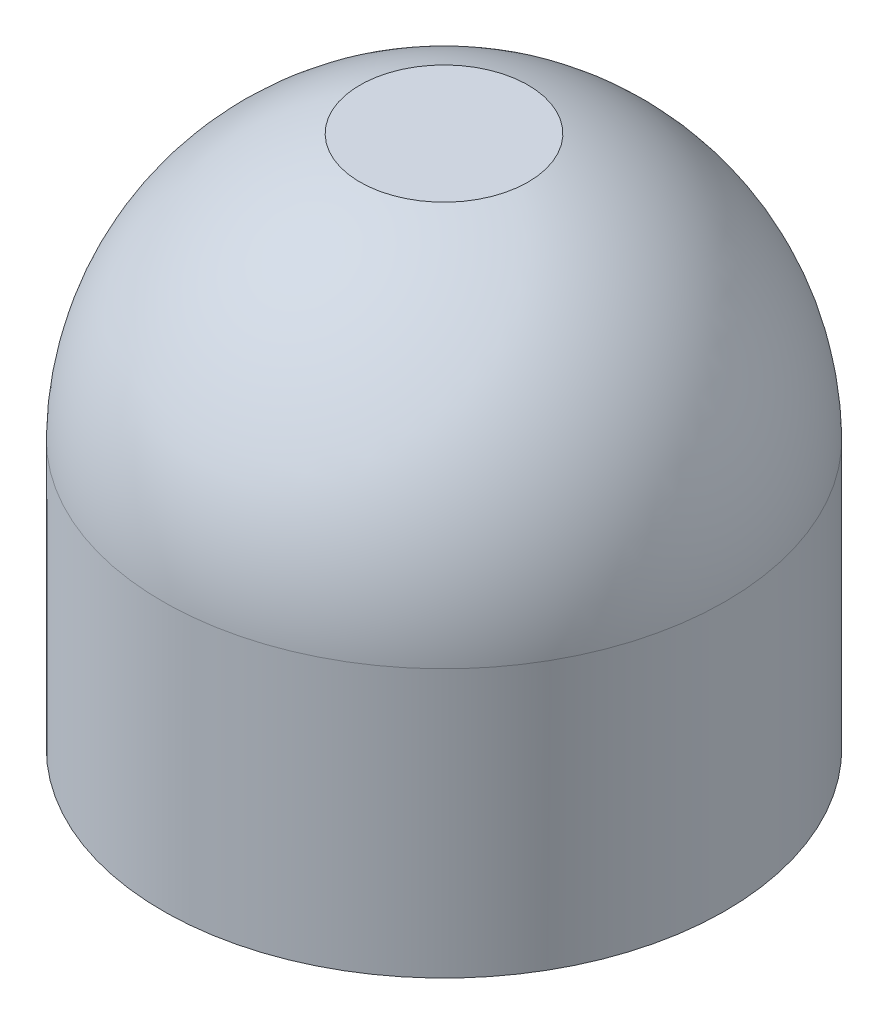
ISO-10303-21;
HEADER;
FILE_DESCRIPTION(('STEP AP214'),'2;1');
FILE_NAME('part.step','',(''),(''),'','','');
FILE_SCHEMA(('AUTOMOTIVE_DESIGN { 1 0 10303 214 1 1 1 1 }'));
ENDSEC;
DATA;
#1=APPLICATION_CONTEXT('core data for automotive mechanical design processes');
#2=APPLICATION_PROTOCOL_DEFINITION('international standard','automotive_design',2000,#1);
#3=PRODUCT_CONTEXT('',#1,'mechanical');
#4=PRODUCT('Part','Part','',(#3));
#5=PRODUCT_RELATED_PRODUCT_CATEGORY('part','',(#4));
#6=PRODUCT_DEFINITION_FORMATION('','',#4);
#7=PRODUCT_DEFINITION_CONTEXT('part definition',#1,'design');
#8=PRODUCT_DEFINITION('design','',#6,#7);
#9=PRODUCT_DEFINITION_SHAPE('','',#8);
#10=(LENGTH_UNIT() NAMED_UNIT(*) SI_UNIT(.MILLI.,.METRE.));
#11=(NAMED_UNIT(*) PLANE_ANGLE_UNIT() SI_UNIT($,.RADIAN.));
#12=(NAMED_UNIT(*) SI_UNIT($,.STERADIAN.) SOLID_ANGLE_UNIT());
#13=UNCERTAINTY_MEASURE_WITH_UNIT(LENGTH_MEASURE(1.E-05),#10,'distance_accuracy_value','');
#14=(GEOMETRIC_REPRESENTATION_CONTEXT(3) GLOBAL_UNCERTAINTY_ASSIGNED_CONTEXT((#13)) GLOBAL_UNIT_ASSIGNED_CONTEXT((#10,
#11,#12)) REPRESENTATION_CONTEXT('',''));
#15=CARTESIAN_POINT('',(0.,0.,0.));
#16=DIRECTION('',(0.,0.,1.));
#17=DIRECTION('',(1.,0.,0.));
#18=AXIS2_PLACEMENT_3D('',#15,#16,#17);
#19=CARTESIAN_POINT('',(0.,5.,0.));
#20=DIRECTION('',(0.,-1.,0.));
#21=DIRECTION('',(0.,0.,-1.));
#22=AXIS2_PLACEMENT_3D('',#19,#20,#21);
#23=CYLINDRICAL_SURFACE('',#22,4.5);
#24=CARTESIAN_POINT('',(0.,1.42618540526485,0.));
#25=DIRECTION('',(0.,1.,0.));
#26=DIRECTION('',(0.,0.,1.));
#27=AXIS2_PLACEMENT_3D('',#24,#25,#26);
#28=CIRCLE('',#27,4.5);
#29=CARTESIAN_POINT('',(-1.5,1.42618540526485,-4.24264068711928));
#30=VERTEX_POINT('',#29);
#31=CARTESIAN_POINT('',(1.32768914699,1.42618540526485,-4.29967923559014));
#32=VERTEX_POINT('',#31);
#33=EDGE_CURVE('E168',#30,#32,#28,.T.);
#34=ORIENTED_EDGE('',*,*,#33,.T.);
#35=DIRECTION('',(0.,-1.,0.));
#36=VECTOR('',#35,1.);
#37=CARTESIAN_POINT('',(1.32768914699,5.,-4.29967923559014));
#38=LINE('',#37,#36);
#39=CARTESIAN_POINT('',(1.32768914699,0.,-4.29967923559014));
#40=VERTEX_POINT('',#39);
#41=EDGE_CURVE('E139',#32,#40,#38,.T.);
#42=ORIENTED_EDGE('',*,*,#41,.T.);
#43=CARTESIAN_POINT('',(0.,0.,0.));
#44=DIRECTION('',(0.,1.,0.));
#45=DIRECTION('',(0.,0.,1.));
#46=AXIS2_PLACEMENT_3D('',#43,#44,#45);
#47=CIRCLE('',#46,4.5);
#48=CARTESIAN_POINT('',(-1.5,0.,-4.24264068711928));
#49=VERTEX_POINT('',#48);
#50=EDGE_CURVE('E203',#49,#40,#47,.T.);
#51=ORIENTED_EDGE('',*,*,#50,.F.);
#52=DIRECTION('',(0.,-1.,0.));
#53=VECTOR('',#52,1.);
#54=CARTESIAN_POINT('',(-1.5,5.,-4.24264068711928));
#55=LINE('',#54,#53);
#56=EDGE_CURVE('E216',#49,#30,#55,.F.);
#57=ORIENTED_EDGE('',*,*,#56,.T.);
#58=EDGE_LOOP('',(#34,#42,#51,#57));
#59=FACE_BOUND('',#58,.T.);
#60=ADVANCED_FACE('F32',(#59),#23,.F.);
#61=CARTESIAN_POINT('',(0.,0.,0.));
#62=DIRECTION('',(0.,1.,0.));
#63=DIRECTION('',(0.,0.,1.));
#64=AXIS2_PLACEMENT_3D('',#61,#62,#63);
#65=PLANE('',#64);
#66=DIRECTION('',(0.,0.,-1.));
#67=VECTOR('',#66,1.);
#68=CARTESIAN_POINT('',(1.32768914699,0.,-3.79563732174866));
#69=LINE('',#68,#67);
#70=CARTESIAN_POINT('',(1.32768914699,0.,-5.07934459639873));
#71=VERTEX_POINT('',#70);
#72=EDGE_CURVE('E192',#40,#71,#69,.T.);
#73=ORIENTED_EDGE('',*,*,#72,.T.);
#74=CARTESIAN_POINT('',(0.,0.,0.));
#75=DIRECTION('',(0.,1.,0.));
#76=DIRECTION('',(0.,0.,1.));
#77=AXIS2_PLACEMENT_3D('',#74,#75,#76);
#78=CIRCLE('',#77,5.25);
#79=CARTESIAN_POINT('',(-1.5,0.,-5.03115294937453));
#80=VERTEX_POINT('',#79);
#81=EDGE_CURVE('E207',#80,#71,#78,.T.);
#82=ORIENTED_EDGE('',*,*,#81,.F.);
#83=DIRECTION('',(0.,0.,1.));
#84=VECTOR('',#83,1.);
#85=CARTESIAN_POINT('',(-1.5,0.,-5.7011070865442));
#86=LINE('',#85,#84);
#87=EDGE_CURVE('E195',#80,#49,#86,.T.);
#88=ORIENTED_EDGE('',*,*,#87,.T.);
#89=ORIENTED_EDGE('',*,*,#50,.T.);
#90=EDGE_LOOP('',(#73,#82,#88,#89));
#91=FACE_BOUND('',#90,.T.);
#92=ADVANCED_FACE('F244',(#91),#65,.F.);
#93=CARTESIAN_POINT('',(0.,5.,0.));
#94=DIRECTION('',(0.,-1.,0.));
#95=DIRECTION('',(0.,0.,-1.));
#96=AXIS2_PLACEMENT_3D('',#93,#94,#95);
#97=CYLINDRICAL_SURFACE('',#96,5.25);
#98=DIRECTION('',(0.,-1.,0.));
#99=VECTOR('',#98,1.);
#100=CARTESIAN_POINT('',(1.32768914699,5.,-5.07934459639873));
#101=LINE('',#100,#99);
#102=CARTESIAN_POINT('',(1.32768914699,5.,-5.07934459639873));
#103=VERTEX_POINT('',#102);
#104=EDGE_CURVE('E201',#103,#71,#101,.T.);
#105=ORIENTED_EDGE('',*,*,#104,.F.);
#106=CARTESIAN_POINT('',(0.,5.,0.));
#107=DIRECTION('',(0.,1.,0.));
#108=DIRECTION('',(0.,0.,1.));
#109=AXIS2_PLACEMENT_3D('',#106,#107,#108);
#110=CIRCLE('',#109,5.25);
#111=CARTESIAN_POINT('',(-1.5,5.,-5.03115294937453));
#112=VERTEX_POINT('',#111);
#113=EDGE_CURVE('E210',#112,#103,#110,.T.);
#114=ORIENTED_EDGE('',*,*,#113,.F.);
#115=DIRECTION('',(0.,-1.,0.));
#116=VECTOR('',#115,1.);
#117=CARTESIAN_POINT('',(-1.5,5.,-5.03115294937453));
#118=LINE('',#117,#116);
#119=EDGE_CURVE('E198',#80,#112,#118,.F.);
#120=ORIENTED_EDGE('',*,*,#119,.F.);
#121=ORIENTED_EDGE('',*,*,#81,.T.);
#122=EDGE_LOOP('',(#105,#114,#120,#121));
#123=FACE_BOUND('',#122,.T.);
#124=ADVANCED_FACE('F34',(#123),#97,.T.);
#125=CARTESIAN_POINT('',(0.,2.02618540526485,0.));
#126=DIRECTION('',(0.,1.,0.));
#127=DIRECTION('',(0.,0.,1.));
#128=AXIS2_PLACEMENT_3D('',#125,#126,#127);
#129=CIRCLE('',#128,4.5);
#130=CARTESIAN_POINT('',(-1.5,2.02618540526485,-4.24264068711928));
#131=VERTEX_POINT('',#130);
#132=CARTESIAN_POINT('',(1.32768914699,2.02618540526485,-4.29967923559014));
#133=VERTEX_POINT('',#132);
#134=EDGE_CURVE('E48',#131,#133,#129,.T.);
#135=ORIENTED_EDGE('',*,*,#134,.F.);
#136=CARTESIAN_POINT('',(-1.5,5.,-4.24264068711928));
#137=VERTEX_POINT('',#136);
#138=EDGE_CURVE('E213',#131,#137,#55,.F.);
#139=ORIENTED_EDGE('',*,*,#138,.T.);
#140=CARTESIAN_POINT('',(0.,5.,0.));
#141=DIRECTION('',(0.,1.,0.));
#142=DIRECTION('',(0.,0.,1.));
#143=AXIS2_PLACEMENT_3D('',#140,#141,#142);
#144=CIRCLE('',#143,4.5);
#145=CARTESIAN_POINT('',(1.32768914699,5.,-4.29967923559014));
#146=VERTEX_POINT('',#145);
#147=EDGE_CURVE('E204',#137,#146,#144,.T.);
#148=ORIENTED_EDGE('',*,*,#147,.T.);
#149=EDGE_CURVE('E218',#146,#133,#38,.T.);
#150=ORIENTED_EDGE('',*,*,#149,.T.);
#151=EDGE_LOOP('',(#135,#139,#148,#150));
#152=FACE_BOUND('',#151,.T.);
#153=ADVANCED_FACE('F254',(#152),#23,.F.);
#154=CARTESIAN_POINT('',(-1.5,5.,-5.7011070865442));
#155=DIRECTION('',(1.,0.,0.));
#156=DIRECTION('',(0.,0.,-1.));
#157=AXIS2_PLACEMENT_3D('',#154,#155,#156);
#158=PLANE('',#157);
#159=ORIENTED_EDGE('',*,*,#119,.T.);
#160=CARTESIAN_POINT('',(-1.5,4.92952702702703,0.));
#161=DIRECTION('',(-1.,0.,0.));
#162=DIRECTION('',(0.,0.,1.));
#163=AXIS2_PLACEMENT_3D('',#160,#161,#162);
#164=CIRCLE('',#163,5.03164649393413);
#165=CARTESIAN_POINT('',(-1.5,7.,-4.58591409733197));
#166=VERTEX_POINT('',#165);
#167=EDGE_CURVE('E187',#112,#166,#164,.F.);
#168=ORIENTED_EDGE('',*,*,#167,.T.);
#169=DIRECTION('',(0.,0.,-1.));
#170=VECTOR('',#169,1.);
#171=CARTESIAN_POINT('',(-1.5,7.,-3.43693177121688));
#172=LINE('',#171,#170);
#173=CARTESIAN_POINT('',(-1.5,7.,-3.43693177121688));
#174=VERTEX_POINT('',#173);
#175=EDGE_CURVE('E176',#174,#166,#172,.T.);
#176=ORIENTED_EDGE('',*,*,#175,.F.);
#177=DIRECTION('',(0.,-1.,0.));
#178=VECTOR('',#177,1.);
#179=CARTESIAN_POINT('',(-1.5,7.,-3.43693177121688));
#180=LINE('',#179,#178);
#181=CARTESIAN_POINT('',(-1.5,5.,-3.43693177121688));
#182=VERTEX_POINT('',#181);
#183=EDGE_CURVE('E185',#174,#182,#180,.T.);
#184=ORIENTED_EDGE('',*,*,#183,.T.);
#185=DIRECTION('',(0.,0.,-1.));
#186=VECTOR('',#185,1.);
#187=CARTESIAN_POINT('',(-1.5,5.,-3.43693177121688));
#188=LINE('',#187,#186);
#189=EDGE_CURVE('E173',#182,#137,#188,.T.);
#190=ORIENTED_EDGE('',*,*,#189,.T.);
#191=ORIENTED_EDGE('',*,*,#138,.F.);
#192=DIRECTION('',(0.,-1.,0.));
#193=VECTOR('',#192,1.);
#194=CARTESIAN_POINT('',(-1.49999999999994,2.02618540526485,-4.24264068711931));
#195=LINE('',#194,#193);
#196=EDGE_CURVE('E55',#131,#30,#195,.T.);
#197=ORIENTED_EDGE('',*,*,#196,.T.);
#198=ORIENTED_EDGE('',*,*,#56,.F.);
#199=ORIENTED_EDGE('',*,*,#87,.F.);
#200=EDGE_LOOP('',(#159,#168,#176,#184,#190,#191,#197,#198,#199));
#201=FACE_BOUND('',#200,.T.);
#202=ADVANCED_FACE('F260',(#201),#158,.T.);
#203=CARTESIAN_POINT('',(1.32768914699,5.,-3.79563732174866));
#204=DIRECTION('',(-1.,0.,0.));
#205=DIRECTION('',(0.,0.,1.));
#206=AXIS2_PLACEMENT_3D('',#203,#204,#205);
#207=PLANE('',#206);
#208=ORIENTED_EDGE('',*,*,#104,.T.);
#209=ORIENTED_EDGE('',*,*,#72,.F.);
#210=ORIENTED_EDGE('',*,*,#41,.F.);
#211=DIRECTION('',(0.,0.757809780047761,0.65247554533788));
#212=VECTOR('',#211,1.);
#213=CARTESIAN_POINT('',(1.32768914699,1.42618540526485,-4.29967923559014));
#214=LINE('',#213,#212);
#215=CARTESIAN_POINT('',(1.32768914699,1.65847297081808,-4.09967923559014));
#216=VERTEX_POINT('',#215);
#217=EDGE_CURVE('E121',#32,#216,#214,.T.);
#218=ORIENTED_EDGE('',*,*,#217,.T.);
#219=DIRECTION('',(0.,1.,0.));
#220=VECTOR('',#219,1.);
#221=CARTESIAN_POINT('',(1.32768914699,1.65847297081808,-4.09967923559014));
#222=LINE('',#221,#220);
#223=CARTESIAN_POINT('',(1.32768914699,1.79427229975996,-4.09967923559014));
#224=VERTEX_POINT('',#223);
#225=EDGE_CURVE('E130',#216,#224,#222,.T.);
#226=ORIENTED_EDGE('',*,*,#225,.T.);
#227=DIRECTION('',(0.,0.757288979444119,-0.653079935086421));
#228=VECTOR('',#227,1.);
#229=CARTESIAN_POINT('',(1.32768914699,2.02618540526485,-4.29967923559014));
#230=LINE('',#229,#228);
#231=EDGE_CURVE('E135',#224,#133,#230,.T.);
#232=ORIENTED_EDGE('',*,*,#231,.T.);
#233=ORIENTED_EDGE('',*,*,#149,.F.);
#234=DIRECTION('',(0.,0.,1.));
#235=VECTOR('',#234,1.);
#236=CARTESIAN_POINT('',(1.32768914699,5.,0.));
#237=LINE('',#236,#235);
#238=CARTESIAN_POINT('',(1.32768914699,5.,-3.50709873384896));
#239=VERTEX_POINT('',#238);
#240=EDGE_CURVE('E41',#146,#239,#237,.T.);
#241=ORIENTED_EDGE('',*,*,#240,.T.);
#242=DIRECTION('',(0.,-1.,0.));
#243=VECTOR('',#242,1.);
#244=CARTESIAN_POINT('',(1.32768914699,7.,-3.50709873384896));
#245=LINE('',#244,#243);
#246=CARTESIAN_POINT('',(1.32768914699,7.,-3.50709873384896));
#247=VERTEX_POINT('',#246);
#248=EDGE_CURVE('E179',#247,#239,#245,.T.);
#249=ORIENTED_EDGE('',*,*,#248,.F.);
#250=DIRECTION('',(0.,0.,1.));
#251=VECTOR('',#250,1.);
#252=CARTESIAN_POINT('',(1.32768914699,7.,-3.50709873384896));
#253=LINE('',#252,#251);
#254=CARTESIAN_POINT('',(1.32768914699,7.,-4.63873362428509));
#255=VERTEX_POINT('',#254);
#256=EDGE_CURVE('E170',#255,#247,#253,.T.);
#257=ORIENTED_EDGE('',*,*,#256,.F.);
#258=CARTESIAN_POINT('',(1.32768914699,4.92952702702703,0.));
#259=DIRECTION('',(1.,0.,0.));
#260=DIRECTION('',(0.,0.,-1.));
#261=AXIS2_PLACEMENT_3D('',#258,#259,#260);
#262=CIRCLE('',#261,5.07983345877447);
#263=EDGE_CURVE('E190',#255,#103,#262,.F.);
#264=ORIENTED_EDGE('',*,*,#263,.T.);
#265=EDGE_LOOP('',(#208,#209,#210,#218,#226,#232,#233,#241,#249,#257,#264));
#266=FACE_BOUND('',#265,.T.);
#267=ADVANCED_FACE('F137',(#266),#207,.T.);
#268=CARTESIAN_POINT('',(0.,4.92952702702703,0.));
#269=DIRECTION('',(0.,-1.,0.));
#270=DIRECTION('',(1.,0.,0.));
#271=AXIS2_PLACEMENT_3D('',#268,#269,#270);
#272=SPHERICAL_SURFACE('',#271,5.25047297297297);
#273=CARTESIAN_POINT('',(0.,9.94,0.));
#274=DIRECTION('',(0.,-1.,0.));
#275=DIRECTION('',(1.,0.,0.));
#276=AXIS2_PLACEMENT_3D('',#273,#274,#275);
#277=CIRCLE('',#276,1.56927595630182);
#278=CARTESIAN_POINT('',(1.56927595630182,9.94,0.));
#279=VERTEX_POINT('',#278);
#280=EDGE_CURVE('E36',#279,#279,#277,.F.);
#281=ORIENTED_EDGE('',*,*,#280,.F.);
#282=EDGE_LOOP('',(#281));
#283=FACE_BOUND('',#282,.T.);
#284=ORIENTED_EDGE('',*,*,#263,.F.);
#285=CARTESIAN_POINT('',(0.,7.,0.));
#286=DIRECTION('',(0.,-1.,0.));
#287=DIRECTION('',(0.,0.,-1.));
#288=AXIS2_PLACEMENT_3D('',#285,#286,#287);
#289=CIRCLE('',#288,4.82499824954456);
#290=EDGE_CURVE('E11',#255,#166,#289,.F.);
#291=ORIENTED_EDGE('',*,*,#290,.T.);
#292=ORIENTED_EDGE('',*,*,#167,.F.);
#293=ORIENTED_EDGE('',*,*,#113,.T.);
#294=EDGE_LOOP('',(#284,#291,#292,#293));
#295=FACE_BOUND('',#294,.T.);
#296=ADVANCED_FACE('F237',(#283,#295),#272,.T.);
#297=CARTESIAN_POINT('',(5.25,5.,0.));
#298=DIRECTION('',(0.,-1.,0.));
#299=DIRECTION('',(0.,0.,-1.));
#300=AXIS2_PLACEMENT_3D('',#297,#298,#299);
#301=PLANE('',#300);
#302=ORIENTED_EDGE('',*,*,#240,.F.);
#303=ORIENTED_EDGE('',*,*,#147,.F.);
#304=ORIENTED_EDGE('',*,*,#189,.F.);
#305=CARTESIAN_POINT('',(0.,5.,0.));
#306=DIRECTION('',(0.,-1.,0.));
#307=DIRECTION('',(0.,0.,-1.));
#308=AXIS2_PLACEMENT_3D('',#305,#306,#307);
#309=CIRCLE('',#308,3.75);
#310=EDGE_CURVE('E180',#239,#182,#309,.T.);
#311=ORIENTED_EDGE('',*,*,#310,.F.);
#312=EDGE_LOOP('',(#302,#303,#304,#311));
#313=FACE_BOUND('',#312,.T.);
#314=ADVANCED_FACE('F229',(#313),#301,.T.);
#315=CARTESIAN_POINT('',(0.,7.,0.));
#316=DIRECTION('',(0.,-1.,0.));
#317=DIRECTION('',(0.,0.,-1.));
#318=AXIS2_PLACEMENT_3D('',#315,#316,#317);
#319=CYLINDRICAL_SURFACE('',#318,3.75);
#320=ORIENTED_EDGE('',*,*,#310,.T.);
#321=ORIENTED_EDGE('',*,*,#183,.F.);
#322=CARTESIAN_POINT('',(0.,7.,0.));
#323=DIRECTION('',(0.,-1.,0.));
#324=DIRECTION('',(0.,0.,-1.));
#325=AXIS2_PLACEMENT_3D('',#322,#323,#324);
#326=CIRCLE('',#325,3.75);
#327=EDGE_CURVE('E172',#247,#174,#326,.T.);
#328=ORIENTED_EDGE('',*,*,#327,.F.);
#329=ORIENTED_EDGE('',*,*,#248,.T.);
#330=EDGE_LOOP('',(#320,#321,#328,#329));
#331=FACE_BOUND('',#330,.T.);
#332=ADVANCED_FACE('F231',(#331),#319,.F.);
#333=CARTESIAN_POINT('',(0.,7.,0.));
#334=DIRECTION('',(0.,-1.,0.));
#335=DIRECTION('',(0.,0.,-1.));
#336=AXIS2_PLACEMENT_3D('',#333,#334,#335);
#337=PLANE('',#336);
#338=ORIENTED_EDGE('',*,*,#256,.T.);
#339=ORIENTED_EDGE('',*,*,#327,.T.);
#340=ORIENTED_EDGE('',*,*,#175,.T.);
#341=ORIENTED_EDGE('',*,*,#290,.F.);
#342=EDGE_LOOP('',(#338,#339,#340,#341));
#343=FACE_BOUND('',#342,.T.);
#344=ADVANCED_FACE('F234',(#343),#337,.T.);
#345=CARTESIAN_POINT('',(0.,9.94,0.));
#346=DIRECTION('',(0.,-1.,0.));
#347=DIRECTION('',(1.,0.,0.));
#348=AXIS2_PLACEMENT_3D('',#345,#346,#347);
#349=PLANE('',#348);
#350=ORIENTED_EDGE('',*,*,#280,.T.);
#351=EDGE_LOOP('',(#350));
#352=FACE_BOUND('',#351,.T.);
#353=ADVANCED_FACE('F153',(#352),#349,.F.);
#354=DIRECTION('',(0.389308051694711,0.757809780047761,0.523606319814451));
#355=VECTOR('',#354,1.);
#356=CARTESIAN_POINT('',(-1.49999999999994,1.42618540526485,-4.24264068711931));
#357=LINE('',#356,#355);
#358=CARTESIAN_POINT('',(0.,1.5,0.));
#359=DIRECTION('',(0.,1.,0.));
#360=AXIS1_PLACEMENT('',#358,#359);
#361=SURFACE_OF_REVOLUTION('',#357,#360);
#362=ORIENTED_EDGE('',*,*,#33,.F.);
#363=CARTESIAN_POINT('',(-1.38066738915301,1.65847297081808,-4.08214231333173));
#364=VERTEX_POINT('',#363);
#365=EDGE_CURVE('E123',#30,#364,#357,.T.);
#366=ORIENTED_EDGE('',*,*,#365,.T.);
#367=CARTESIAN_POINT('',(0.,1.65847297081808,0.));
#368=DIRECTION('',(0.,1.,0.));
#369=DIRECTION('',(0.,0.,1.));
#370=AXIS2_PLACEMENT_3D('',#367,#368,#369);
#371=CIRCLE('',#370,4.30930717236123);
#372=EDGE_CURVE('E116',#364,#216,#371,.T.);
#373=ORIENTED_EDGE('',*,*,#372,.T.);
#374=ORIENTED_EDGE('',*,*,#217,.F.);
#375=EDGE_LOOP('',(#362,#366,#373,#374));
#376=FACE_BOUND('',#375,.T.);
#377=ADVANCED_FACE('F119',(#376),#361,.F.);
#378=DIRECTION('',(-0.389668668728023,0.757288979444119,-0.524091337673324));
#379=VECTOR('',#378,1.);
#380=CARTESIAN_POINT('',(-1.49999999999994,2.02618540526485,-4.24264068711931));
#381=LINE('',#380,#379);
#382=CARTESIAN_POINT('',(0.,1.5,0.));
#383=DIRECTION('',(0.,1.,0.));
#384=AXIS1_PLACEMENT('',#382,#383);
#385=SURFACE_OF_REVOLUTION('',#381,#384);
#386=CARTESIAN_POINT('',(0.,1.79427229975996,0.));
#387=DIRECTION('',(0.,1.,0.));
#388=DIRECTION('',(0.,0.,1.));
#389=AXIS2_PLACEMENT_3D('',#386,#387,#388);
#390=CIRCLE('',#389,4.30930717236123);
#391=CARTESIAN_POINT('',(-1.38066738915301,1.79427229975996,-4.08214231333173));
#392=VERTEX_POINT('',#391);
#393=EDGE_CURVE('E127',#392,#224,#390,.T.);
#394=ORIENTED_EDGE('',*,*,#393,.F.);
#395=EDGE_CURVE('E161',#392,#131,#381,.T.);
#396=ORIENTED_EDGE('',*,*,#395,.T.);
#397=ORIENTED_EDGE('',*,*,#134,.T.);
#398=ORIENTED_EDGE('',*,*,#231,.F.);
#399=EDGE_LOOP('',(#394,#396,#397,#398));
#400=FACE_BOUND('',#399,.T.);
#401=ADVANCED_FACE('F152',(#400),#385,.F.);
#402=CARTESIAN_POINT('',(0.,1.5,0.));
#403=DIRECTION('',(0.,1.,0.));
#404=DIRECTION('',(0.,0.,1.));
#405=AXIS2_PLACEMENT_3D('',#402,#403,#404);
#406=CYLINDRICAL_SURFACE('',#405,4.30930717236123);
#407=DIRECTION('',(0.,1.,0.));
#408=VECTOR('',#407,1.);
#409=CARTESIAN_POINT('',(-1.38066738915301,1.65847297081808,-4.08214231333173));
#410=LINE('',#409,#408);
#411=EDGE_CURVE('E146',#364,#392,#410,.T.);
#412=ORIENTED_EDGE('',*,*,#411,.T.);
#413=ORIENTED_EDGE('',*,*,#393,.T.);
#414=ORIENTED_EDGE('',*,*,#225,.F.);
#415=ORIENTED_EDGE('',*,*,#372,.F.);
#416=EDGE_LOOP('',(#412,#413,#414,#415));
#417=FACE_BOUND('',#416,.T.);
#418=ADVANCED_FACE('F131',(#417),#406,.F.);
#419=CARTESIAN_POINT('',(1.06545974493653,0.,-0.792183061517232));
#420=DIRECTION('',(0.802491868937869,0.,-0.596663054234638));
#421=DIRECTION('',(-0.596663054234638,0.,-0.802491868937869));
#422=AXIS2_PLACEMENT_3D('',#419,#420,#421);
#423=PLANE('',#422);
#424=ORIENTED_EDGE('',*,*,#365,.F.);
#425=ORIENTED_EDGE('',*,*,#196,.F.);
#426=ORIENTED_EDGE('',*,*,#395,.F.);
#427=ORIENTED_EDGE('',*,*,#411,.F.);
#428=EDGE_LOOP('',(#424,#425,#426,#427));
#429=FACE_BOUND('',#428,.T.);
#430=ADVANCED_FACE('F154',(#429),#423,.T.);
#431=CLOSED_SHELL('',(#60,#92,#124,#153,#202,#267,#296,#314,#332,#344,#353,#377,#401,#418,#430));
#432=MANIFOLD_SOLID_BREP('B2',#431);
#433=ADVANCED_BREP_SHAPE_REPRESENTATION('',(#18,#432),#14);
#434=SHAPE_DEFINITION_REPRESENTATION(#9,#433);
ENDSEC;
END-ISO-10303-21;
